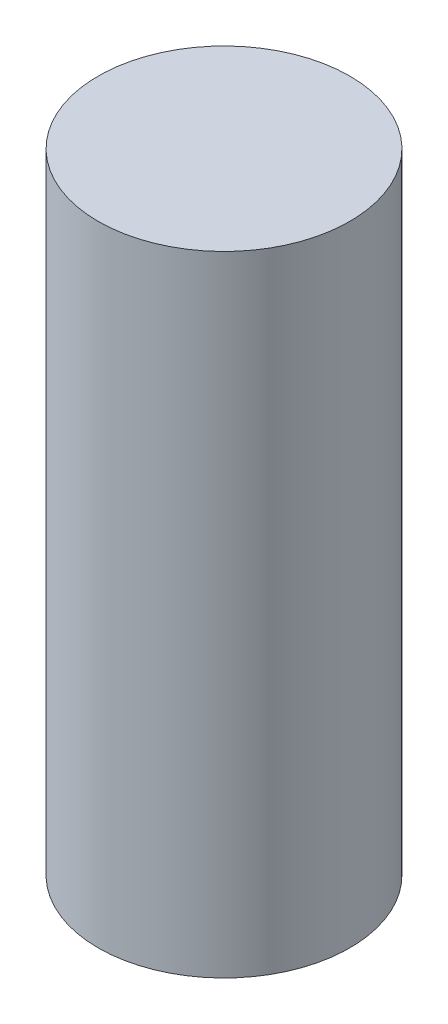
ISO-10303-21;
HEADER;
FILE_DESCRIPTION(('STEP AP214'),'2;1');
FILE_NAME('part.step','',(''),(''),'','','');
FILE_SCHEMA(('AUTOMOTIVE_DESIGN { 1 0 10303 214 1 1 1 1 }'));
ENDSEC;
DATA;
#1=APPLICATION_CONTEXT('core data for automotive mechanical design processes');
#2=APPLICATION_PROTOCOL_DEFINITION('international standard','automotive_design',2000,#1);
#3=PRODUCT_CONTEXT('',#1,'mechanical');
#4=PRODUCT('Part','Part','',(#3));
#5=PRODUCT_RELATED_PRODUCT_CATEGORY('part','',(#4));
#6=PRODUCT_DEFINITION_FORMATION('','',#4);
#7=PRODUCT_DEFINITION_CONTEXT('part definition',#1,'design');
#8=PRODUCT_DEFINITION('design','',#6,#7);
#9=PRODUCT_DEFINITION_SHAPE('','',#8);
#10=(LENGTH_UNIT() NAMED_UNIT(*) SI_UNIT(.MILLI.,.METRE.));
#11=(NAMED_UNIT(*) PLANE_ANGLE_UNIT() SI_UNIT($,.RADIAN.));
#12=(NAMED_UNIT(*) SI_UNIT($,.STERADIAN.) SOLID_ANGLE_UNIT());
#13=UNCERTAINTY_MEASURE_WITH_UNIT(LENGTH_MEASURE(1.E-05),#10,'distance_accuracy_value','');
#14=(GEOMETRIC_REPRESENTATION_CONTEXT(3) GLOBAL_UNCERTAINTY_ASSIGNED_CONTEXT((#13)) GLOBAL_UNIT_ASSIGNED_CONTEXT((#10,
#11,#12)) REPRESENTATION_CONTEXT('',''));
#15=CARTESIAN_POINT('',(0.,0.,0.));
#16=DIRECTION('',(0.,0.,1.));
#17=DIRECTION('',(1.,0.,0.));
#18=AXIS2_PLACEMENT_3D('',#15,#16,#17);
#19=CARTESIAN_POINT('',(0.,12.,0.));
#20=DIRECTION('',(0.,-1.,0.));
#21=DIRECTION('',(0.,0.,-1.));
#22=AXIS2_PLACEMENT_3D('',#19,#20,#21);
#23=CYLINDRICAL_SURFACE('',#22,2.4);
#24=CARTESIAN_POINT('',(0.,12.,0.));
#25=DIRECTION('',(0.,1.,0.));
#26=DIRECTION('',(0.,0.,1.));
#27=AXIS2_PLACEMENT_3D('',#24,#25,#26);
#28=CIRCLE('',#27,2.4);
#29=CARTESIAN_POINT('',(0.,12.,2.4));
#30=VERTEX_POINT('',#29);
#31=EDGE_CURVE('E10',#30,#30,#28,.T.);
#32=ORIENTED_EDGE('',*,*,#31,.F.);
#33=EDGE_LOOP('',(#32));
#34=FACE_BOUND('',#33,.T.);
#35=CARTESIAN_POINT('',(0.,0.,0.));
#36=DIRECTION('',(0.,1.,0.));
#37=DIRECTION('',(0.,0.,1.));
#38=AXIS2_PLACEMENT_3D('',#35,#36,#37);
#39=CIRCLE('',#38,2.4);
#40=CARTESIAN_POINT('',(0.,0.,2.4));
#41=VERTEX_POINT('',#40);
#42=EDGE_CURVE('E40',#41,#41,#39,.T.);
#43=ORIENTED_EDGE('',*,*,#42,.T.);
#44=EDGE_LOOP('',(#43));
#45=FACE_BOUND('',#44,.T.);
#46=ADVANCED_FACE('F37',(#34,#45),#23,.T.);
#47=CARTESIAN_POINT('',(0.,12.,0.));
#48=DIRECTION('',(0.,1.,0.));
#49=DIRECTION('',(0.,0.,1.));
#50=AXIS2_PLACEMENT_3D('',#47,#48,#49);
#51=PLANE('',#50);
#52=ORIENTED_EDGE('',*,*,#31,.T.);
#53=EDGE_LOOP('',(#52));
#54=FACE_BOUND('',#53,.T.);
#55=ADVANCED_FACE('F52',(#54),#51,.T.);
#56=CARTESIAN_POINT('',(0.,0.,0.));
#57=DIRECTION('',(0.,1.,0.));
#58=DIRECTION('',(0.,0.,1.));
#59=AXIS2_PLACEMENT_3D('',#56,#57,#58);
#60=PLANE('',#59);
#61=ORIENTED_EDGE('',*,*,#42,.F.);
#62=EDGE_LOOP('',(#61));
#63=FACE_BOUND('',#62,.T.);
#64=ADVANCED_FACE('F50',(#63),#60,.F.);
#65=CLOSED_SHELL('',(#46,#55,#64));
#66=MANIFOLD_SOLID_BREP('B2',#65);
#67=ADVANCED_BREP_SHAPE_REPRESENTATION('',(#18,#66),#14);
#68=SHAPE_DEFINITION_REPRESENTATION(#9,#67);
ENDSEC;
END-ISO-10303-21;
